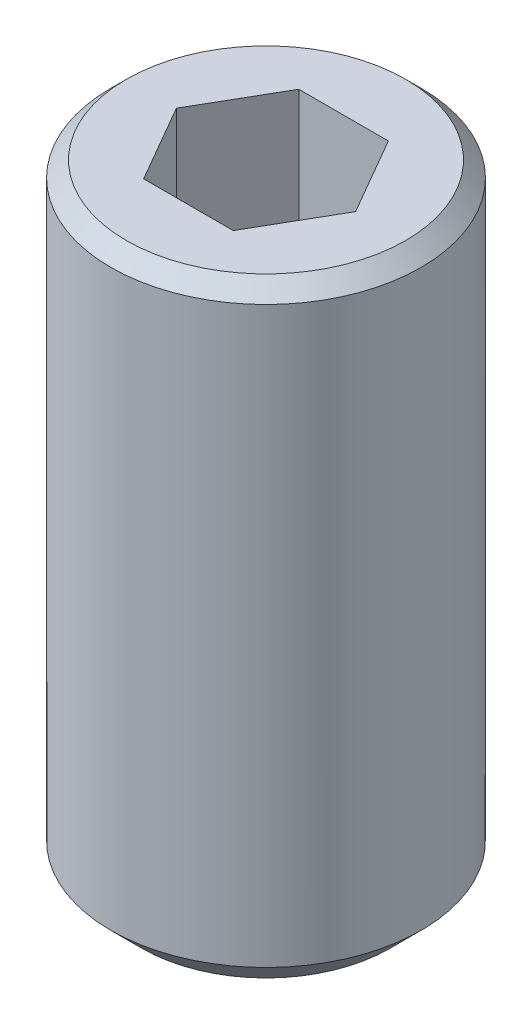
ISO-10303-21;
HEADER;
FILE_DESCRIPTION(('STEP AP214'),'2;1');
FILE_NAME('part.step','',(''),(''),'','','');
FILE_SCHEMA(('AUTOMOTIVE_DESIGN { 1 0 10303 214 1 1 1 1 }'));
ENDSEC;
DATA;
#1=APPLICATION_CONTEXT('core data for automotive mechanical design processes');
#2=APPLICATION_PROTOCOL_DEFINITION('international standard','automotive_design',2000,#1);
#3=PRODUCT_CONTEXT('',#1,'mechanical');
#4=PRODUCT('Part','Part','',(#3));
#5=PRODUCT_RELATED_PRODUCT_CATEGORY('part','',(#4));
#6=PRODUCT_DEFINITION_FORMATION('','',#4);
#7=PRODUCT_DEFINITION_CONTEXT('part definition',#1,'design');
#8=PRODUCT_DEFINITION('design','',#6,#7);
#9=PRODUCT_DEFINITION_SHAPE('','',#8);
#10=(LENGTH_UNIT() NAMED_UNIT(*) SI_UNIT(.MILLI.,.METRE.));
#11=(NAMED_UNIT(*) PLANE_ANGLE_UNIT() SI_UNIT($,.RADIAN.));
#12=(NAMED_UNIT(*) SI_UNIT($,.STERADIAN.) SOLID_ANGLE_UNIT());
#13=UNCERTAINTY_MEASURE_WITH_UNIT(LENGTH_MEASURE(1.E-05),#10,'distance_accuracy_value','');
#14=(GEOMETRIC_REPRESENTATION_CONTEXT(3) GLOBAL_UNCERTAINTY_ASSIGNED_CONTEXT((#13)) GLOBAL_UNIT_ASSIGNED_CONTEXT((#10,
#11,#12)) REPRESENTATION_CONTEXT('',''));
#15=CARTESIAN_POINT('',(0.,0.,0.));
#16=DIRECTION('',(0.,0.,1.));
#17=DIRECTION('',(1.,0.,0.));
#18=AXIS2_PLACEMENT_3D('',#15,#16,#17);
#19=CARTESIAN_POINT('',(0.,0.,0.));
#20=DIRECTION('',(0.,-1.,0.));
#21=DIRECTION('',(0.,0.,-1.));
#22=AXIS2_PLACEMENT_3D('',#19,#20,#21);
#23=PLANE('',#22);
#24=CARTESIAN_POINT('',(0.,0.,0.));
#25=DIRECTION('',(0.,-1.,0.));
#26=DIRECTION('',(0.,0.,-1.));
#27=AXIS2_PLACEMENT_3D('',#24,#25,#26);
#28=CIRCLE('',#27,1.35);
#29=CARTESIAN_POINT('',(0.,0.,-1.35));
#30=VERTEX_POINT('',#29);
#31=EDGE_CURVE('E42',#30,#30,#28,.F.);
#32=ORIENTED_EDGE('',*,*,#31,.T.);
#33=EDGE_LOOP('',(#32));
#34=FACE_BOUND('',#33,.T.);
#35=DIRECTION('',(-0.5,0.,0.866025403784439));
#36=VECTOR('',#35,1.);
#37=CARTESIAN_POINT('',(-0.43301270189222,0.,-0.75));
#38=LINE('',#37,#36);
#39=CARTESIAN_POINT('',(-0.43301270189222,0.,-0.75));
#40=VERTEX_POINT('',#39);
#41=CARTESIAN_POINT('',(-0.866025403784439,0.,0.));
#42=VERTEX_POINT('',#41);
#43=EDGE_CURVE('E123',#40,#42,#38,.T.);
#44=ORIENTED_EDGE('',*,*,#43,.F.);
#45=DIRECTION('',(-1.,0.,0.));
#46=VECTOR('',#45,1.);
#47=CARTESIAN_POINT('',(0.43301270189222,0.,-0.75));
#48=LINE('',#47,#46);
#49=CARTESIAN_POINT('',(0.43301270189222,0.,-0.75));
#50=VERTEX_POINT('',#49);
#51=EDGE_CURVE('E49',#50,#40,#48,.T.);
#52=ORIENTED_EDGE('',*,*,#51,.F.);
#53=DIRECTION('',(-0.5,0.,-0.866025403784439));
#54=VECTOR('',#53,1.);
#55=CARTESIAN_POINT('',(0.866025403784439,0.,0.));
#56=LINE('',#55,#54);
#57=CARTESIAN_POINT('',(0.866025403784439,0.,0.));
#58=VERTEX_POINT('',#57);
#59=EDGE_CURVE('E132',#58,#50,#56,.T.);
#60=ORIENTED_EDGE('',*,*,#59,.F.);
#61=DIRECTION('',(0.5,0.,-0.866025403784439));
#62=VECTOR('',#61,1.);
#63=CARTESIAN_POINT('',(0.43301270189222,0.,0.75));
#64=LINE('',#63,#62);
#65=CARTESIAN_POINT('',(0.43301270189222,0.,0.75));
#66=VERTEX_POINT('',#65);
#67=EDGE_CURVE('E130',#66,#58,#64,.T.);
#68=ORIENTED_EDGE('',*,*,#67,.F.);
#69=DIRECTION('',(1.,0.,0.));
#70=VECTOR('',#69,1.);
#71=CARTESIAN_POINT('',(-0.433012701892219,0.,0.750000000000001));
#72=LINE('',#71,#70);
#73=CARTESIAN_POINT('',(-0.433012701892219,0.,0.750000000000001));
#74=VERTEX_POINT('',#73);
#75=EDGE_CURVE('E97',#74,#66,#72,.T.);
#76=ORIENTED_EDGE('',*,*,#75,.F.);
#77=DIRECTION('',(0.5,0.,0.866025403784438));
#78=VECTOR('',#77,1.);
#79=CARTESIAN_POINT('',(-0.866025403784439,0.,0.));
#80=LINE('',#79,#78);
#81=EDGE_CURVE('E126',#42,#74,#80,.T.);
#82=ORIENTED_EDGE('',*,*,#81,.F.);
#83=EDGE_LOOP('',(#44,#52,#60,#68,#76,#82));
#84=FACE_BOUND('',#83,.T.);
#85=ADVANCED_FACE('F34',(#34,#84),#23,.F.);
#86=CARTESIAN_POINT('',(0.,0.,0.));
#87=DIRECTION('',(0.,1.,0.));
#88=DIRECTION('',(0.,0.,1.));
#89=AXIS2_PLACEMENT_3D('',#86,#87,#88);
#90=CYLINDRICAL_SURFACE('',#89,1.5);
#91=CARTESIAN_POINT('',(0.,-0.150000000000001,0.));
#92=DIRECTION('',(0.,-1.,0.));
#93=DIRECTION('',(0.,0.,-1.));
#94=AXIS2_PLACEMENT_3D('',#91,#92,#93);
#95=CIRCLE('',#94,1.5);
#96=CARTESIAN_POINT('',(0.,-0.150000000000001,-1.5));
#97=VERTEX_POINT('',#96);
#98=EDGE_CURVE('E11',#97,#97,#95,.T.);
#99=ORIENTED_EDGE('',*,*,#98,.T.);
#100=EDGE_LOOP('',(#99));
#101=FACE_BOUND('',#100,.T.);
#102=CARTESIAN_POINT('',(0.,-5.7,0.));
#103=DIRECTION('',(0.,1.,0.));
#104=DIRECTION('',(0.,0.,1.));
#105=AXIS2_PLACEMENT_3D('',#102,#103,#104);
#106=CIRCLE('',#105,1.5);
#107=CARTESIAN_POINT('',(0.,-5.7,1.5));
#108=VERTEX_POINT('',#107);
#109=EDGE_CURVE('E136',#108,#108,#106,.T.);
#110=ORIENTED_EDGE('',*,*,#109,.T.);
#111=EDGE_LOOP('',(#110));
#112=FACE_BOUND('',#111,.T.);
#113=ADVANCED_FACE('F160',(#101,#112),#90,.T.);
#114=CARTESIAN_POINT('',(1.5,-6.,0.));
#115=DIRECTION('',(0.,1.,0.));
#116=DIRECTION('',(0.,0.,1.));
#117=AXIS2_PLACEMENT_3D('',#114,#115,#116);
#118=PLANE('',#117);
#119=CARTESIAN_POINT('',(0.,-6.,0.));
#120=DIRECTION('',(0.,1.,0.));
#121=DIRECTION('',(0.,0.,1.));
#122=AXIS2_PLACEMENT_3D('',#119,#120,#121);
#123=CIRCLE('',#122,1.2);
#124=CARTESIAN_POINT('',(0.,-6.,1.2));
#125=VERTEX_POINT('',#124);
#126=EDGE_CURVE('E144',#125,#125,#123,.F.);
#127=ORIENTED_EDGE('',*,*,#126,.T.);
#128=EDGE_LOOP('',(#127));
#129=FACE_BOUND('',#128,.T.);
#130=ADVANCED_FACE('F165',(#129),#118,.F.);
#131=CARTESIAN_POINT('',(0.43301270189222,-1.5,-0.75));
#132=DIRECTION('',(0.,0.,-1.));
#133=DIRECTION('',(-1.,0.,0.));
#134=AXIS2_PLACEMENT_3D('',#131,#132,#133);
#135=PLANE('',#134);
#136=ORIENTED_EDGE('',*,*,#51,.T.);
#137=DIRECTION('',(0.,1.,0.));
#138=VECTOR('',#137,1.);
#139=CARTESIAN_POINT('',(-0.43301270189222,-1.5,-0.75));
#140=LINE('',#139,#138);
#141=CARTESIAN_POINT('',(-0.43301270189222,-1.5,-0.75));
#142=VERTEX_POINT('',#141);
#143=EDGE_CURVE('E79',#142,#40,#140,.T.);
#144=ORIENTED_EDGE('',*,*,#143,.F.);
#145=DIRECTION('',(-1.,0.,0.));
#146=VECTOR('',#145,1.);
#147=CARTESIAN_POINT('',(0.43301270189222,-1.5,-0.75));
#148=LINE('',#147,#146);
#149=CARTESIAN_POINT('',(0.43301270189222,-1.5,-0.75));
#150=VERTEX_POINT('',#149);
#151=EDGE_CURVE('E134',#150,#142,#148,.T.);
#152=ORIENTED_EDGE('',*,*,#151,.F.);
#153=DIRECTION('',(0.,1.,0.));
#154=VECTOR('',#153,1.);
#155=CARTESIAN_POINT('',(0.43301270189222,-1.5,-0.75));
#156=LINE('',#155,#154);
#157=EDGE_CURVE('E57',#150,#50,#156,.T.);
#158=ORIENTED_EDGE('',*,*,#157,.T.);
#159=EDGE_LOOP('',(#136,#144,#152,#158));
#160=FACE_BOUND('',#159,.T.);
#161=ADVANCED_FACE('F171',(#160),#135,.F.);
#162=CARTESIAN_POINT('',(0.866025403784439,-1.5,0.));
#163=DIRECTION('',(0.866025403784439,0.,-0.5));
#164=DIRECTION('',(-0.5,0.,-0.866025403784439));
#165=AXIS2_PLACEMENT_3D('',#162,#163,#164);
#166=PLANE('',#165);
#167=ORIENTED_EDGE('',*,*,#59,.T.);
#168=ORIENTED_EDGE('',*,*,#157,.F.);
#169=DIRECTION('',(-0.5,0.,-0.866025403784439));
#170=VECTOR('',#169,1.);
#171=CARTESIAN_POINT('',(0.866025403784439,-1.5,0.));
#172=LINE('',#171,#170);
#173=CARTESIAN_POINT('',(0.866025403784439,-1.5,0.));
#174=VERTEX_POINT('',#173);
#175=EDGE_CURVE('E109',#174,#150,#172,.T.);
#176=ORIENTED_EDGE('',*,*,#175,.F.);
#177=DIRECTION('',(0.,1.,0.));
#178=VECTOR('',#177,1.);
#179=CARTESIAN_POINT('',(0.866025403784439,-1.5,0.));
#180=LINE('',#179,#178);
#181=EDGE_CURVE('E101',#174,#58,#180,.T.);
#182=ORIENTED_EDGE('',*,*,#181,.T.);
#183=EDGE_LOOP('',(#167,#168,#176,#182));
#184=FACE_BOUND('',#183,.T.);
#185=ADVANCED_FACE('F175',(#184),#166,.F.);
#186=CARTESIAN_POINT('',(0.43301270189222,-1.5,0.75));
#187=DIRECTION('',(0.866025403784439,0.,0.5));
#188=DIRECTION('',(0.5,0.,-0.866025403784439));
#189=AXIS2_PLACEMENT_3D('',#186,#187,#188);
#190=PLANE('',#189);
#191=ORIENTED_EDGE('',*,*,#67,.T.);
#192=ORIENTED_EDGE('',*,*,#181,.F.);
#193=DIRECTION('',(0.5,0.,-0.866025403784439));
#194=VECTOR('',#193,1.);
#195=CARTESIAN_POINT('',(0.43301270189222,-1.5,0.75));
#196=LINE('',#195,#194);
#197=CARTESIAN_POINT('',(0.43301270189222,-1.5,0.75));
#198=VERTEX_POINT('',#197);
#199=EDGE_CURVE('E105',#198,#174,#196,.T.);
#200=ORIENTED_EDGE('',*,*,#199,.F.);
#201=DIRECTION('',(0.,1.,0.));
#202=VECTOR('',#201,1.);
#203=CARTESIAN_POINT('',(0.43301270189222,-1.5,0.75));
#204=LINE('',#203,#202);
#205=EDGE_CURVE('E90',#198,#66,#204,.T.);
#206=ORIENTED_EDGE('',*,*,#205,.T.);
#207=EDGE_LOOP('',(#191,#192,#200,#206));
#208=FACE_BOUND('',#207,.T.);
#209=ADVANCED_FACE('F106',(#208),#190,.F.);
#210=CARTESIAN_POINT('',(-0.433012701892219,-1.5,0.750000000000001));
#211=DIRECTION('',(0.,0.,1.));
#212=DIRECTION('',(1.,0.,0.));
#213=AXIS2_PLACEMENT_3D('',#210,#211,#212);
#214=PLANE('',#213);
#215=ORIENTED_EDGE('',*,*,#75,.T.);
#216=ORIENTED_EDGE('',*,*,#205,.F.);
#217=DIRECTION('',(1.,0.,0.));
#218=VECTOR('',#217,1.);
#219=CARTESIAN_POINT('',(-0.433012701892219,-1.5,0.750000000000001));
#220=LINE('',#219,#218);
#221=CARTESIAN_POINT('',(-0.433012701892219,-1.5,0.750000000000001));
#222=VERTEX_POINT('',#221);
#223=EDGE_CURVE('E94',#222,#198,#220,.T.);
#224=ORIENTED_EDGE('',*,*,#223,.F.);
#225=DIRECTION('',(0.,1.,0.));
#226=VECTOR('',#225,1.);
#227=CARTESIAN_POINT('',(-0.433012701892219,-1.5,0.750000000000001));
#228=LINE('',#227,#226);
#229=EDGE_CURVE('E102',#222,#74,#228,.T.);
#230=ORIENTED_EDGE('',*,*,#229,.T.);
#231=EDGE_LOOP('',(#215,#216,#224,#230));
#232=FACE_BOUND('',#231,.T.);
#233=ADVANCED_FACE('F92',(#232),#214,.F.);
#234=CARTESIAN_POINT('',(-0.866025403784439,-1.5,0.));
#235=DIRECTION('',(-0.866025403784438,0.,0.5));
#236=DIRECTION('',(0.5,0.,0.866025403784438));
#237=AXIS2_PLACEMENT_3D('',#234,#235,#236);
#238=PLANE('',#237);
#239=ORIENTED_EDGE('',*,*,#81,.T.);
#240=ORIENTED_EDGE('',*,*,#229,.F.);
#241=DIRECTION('',(0.5,0.,0.866025403784438));
#242=VECTOR('',#241,1.);
#243=CARTESIAN_POINT('',(-0.866025403784439,-1.5,0.));
#244=LINE('',#243,#242);
#245=CARTESIAN_POINT('',(-0.866025403784439,-1.5,0.));
#246=VERTEX_POINT('',#245);
#247=EDGE_CURVE('E115',#246,#222,#244,.T.);
#248=ORIENTED_EDGE('',*,*,#247,.F.);
#249=DIRECTION('',(0.,1.,0.));
#250=VECTOR('',#249,1.);
#251=CARTESIAN_POINT('',(-0.866025403784439,-1.5,0.));
#252=LINE('',#251,#250);
#253=EDGE_CURVE('E139',#246,#42,#252,.T.);
#254=ORIENTED_EDGE('',*,*,#253,.T.);
#255=EDGE_LOOP('',(#239,#240,#248,#254));
#256=FACE_BOUND('',#255,.T.);
#257=ADVANCED_FACE('F179',(#256),#238,.F.);
#258=CARTESIAN_POINT('',(-0.43301270189222,-1.5,-0.75));
#259=DIRECTION('',(-0.866025403784439,0.,-0.5));
#260=DIRECTION('',(-0.5,0.,0.866025403784439));
#261=AXIS2_PLACEMENT_3D('',#258,#259,#260);
#262=PLANE('',#261);
#263=ORIENTED_EDGE('',*,*,#43,.T.);
#264=ORIENTED_EDGE('',*,*,#253,.F.);
#265=DIRECTION('',(-0.5,0.,0.866025403784439));
#266=VECTOR('',#265,1.);
#267=CARTESIAN_POINT('',(-0.43301270189222,-1.5,-0.75));
#268=LINE('',#267,#266);
#269=EDGE_CURVE('E117',#142,#246,#268,.T.);
#270=ORIENTED_EDGE('',*,*,#269,.F.);
#271=ORIENTED_EDGE('',*,*,#143,.T.);
#272=EDGE_LOOP('',(#263,#264,#270,#271));
#273=FACE_BOUND('',#272,.T.);
#274=ADVANCED_FACE('F176',(#273),#262,.F.);
#275=CARTESIAN_POINT('',(-0.43301270189222,-1.5,-0.75));
#276=DIRECTION('',(0.,1.,0.));
#277=DIRECTION('',(0.,0.,1.));
#278=AXIS2_PLACEMENT_3D('',#275,#276,#277);
#279=PLANE('',#278);
#280=ORIENTED_EDGE('',*,*,#151,.T.);
#281=ORIENTED_EDGE('',*,*,#269,.T.);
#282=ORIENTED_EDGE('',*,*,#247,.T.);
#283=ORIENTED_EDGE('',*,*,#223,.T.);
#284=ORIENTED_EDGE('',*,*,#199,.T.);
#285=ORIENTED_EDGE('',*,*,#175,.T.);
#286=EDGE_LOOP('',(#280,#281,#282,#283,#284,#285));
#287=FACE_BOUND('',#286,.T.);
#288=ADVANCED_FACE('F112',(#287),#279,.T.);
#289=CARTESIAN_POINT('',(0.,-5.7,0.));
#290=DIRECTION('',(0.,1.,0.));
#291=DIRECTION('',(0.,0.,1.));
#292=AXIS2_PLACEMENT_3D('',#289,#290,#291);
#293=CONICAL_SURFACE('',#292,1.5,0.785398163397451);
#294=ORIENTED_EDGE('',*,*,#126,.F.);
#295=EDGE_LOOP('',(#294));
#296=FACE_BOUND('',#295,.T.);
#297=ORIENTED_EDGE('',*,*,#109,.F.);
#298=EDGE_LOOP('',(#297));
#299=FACE_BOUND('',#298,.T.);
#300=ADVANCED_FACE('F152',(#296,#299),#293,.T.);
#301=CARTESIAN_POINT('',(0.,0.,0.));
#302=DIRECTION('',(0.,-1.,0.));
#303=DIRECTION('',(0.,0.,-1.));
#304=AXIS2_PLACEMENT_3D('',#301,#302,#303);
#305=CONICAL_SURFACE('',#304,1.35,0.785398163397446);
#306=CARTESIAN_POINT('',(0.,-0.150000000000001,-1.5));
#307=CARTESIAN_POINT('',(0.,-0.148437500000001,-1.4984375));
#308=CARTESIAN_POINT('',(0.,-0.146875000000001,-1.496875));
#309=CARTESIAN_POINT('',(0.,-0.143750000000001,-1.49375));
#310=CARTESIAN_POINT('',(0.,-0.142187500000001,-1.4921875));
#311=CARTESIAN_POINT('',(0.,-0.139062500000001,-1.4890625));
#312=CARTESIAN_POINT('',(0.,-0.137500000000001,-1.4875));
#313=CARTESIAN_POINT('',(0.,-0.134375000000001,-1.484375));
#314=CARTESIAN_POINT('',(0.,-0.132812500000001,-1.4828125));
#315=CARTESIAN_POINT('',(0.,-0.129687500000001,-1.4796875));
#316=CARTESIAN_POINT('',(0.,-0.128125000000001,-1.478125));
#317=CARTESIAN_POINT('',(0.,-0.125000000000001,-1.475));
#318=CARTESIAN_POINT('',(0.,-0.123437500000001,-1.4734375));
#319=CARTESIAN_POINT('',(0.,-0.120312500000001,-1.4703125));
#320=CARTESIAN_POINT('',(0.,-0.118750000000001,-1.46875));
#321=CARTESIAN_POINT('',(0.,-0.115625000000001,-1.465625));
#322=CARTESIAN_POINT('',(0.,-0.114062500000001,-1.4640625));
#323=CARTESIAN_POINT('',(0.,-0.110937500000001,-1.4609375));
#324=CARTESIAN_POINT('',(0.,-0.109375000000001,-1.459375));
#325=CARTESIAN_POINT('',(0.,-0.106250000000001,-1.45625));
#326=CARTESIAN_POINT('',(0.,-0.104687500000001,-1.4546875));
#327=CARTESIAN_POINT('',(0.,-0.101562500000001,-1.4515625));
#328=CARTESIAN_POINT('',(0.,-0.100000000000001,-1.45));
#329=CARTESIAN_POINT('',(0.,-0.096875000000001,-1.446875));
#330=CARTESIAN_POINT('',(0.,-0.095312500000001,-1.4453125));
#331=CARTESIAN_POINT('',(0.,-0.0921875000000009,-1.4421875));
#332=CARTESIAN_POINT('',(0.,-0.0906250000000009,-1.440625));
#333=CARTESIAN_POINT('',(0.,-0.0875000000000009,-1.4375));
#334=CARTESIAN_POINT('',(0.,-0.0859375000000009,-1.4359375));
#335=CARTESIAN_POINT('',(0.,-0.0828125000000009,-1.4328125));
#336=CARTESIAN_POINT('',(0.,-0.0812500000000008,-1.43125));
#337=CARTESIAN_POINT('',(0.,-0.0781250000000008,-1.428125));
#338=CARTESIAN_POINT('',(0.,-0.0765625000000008,-1.4265625));
#339=CARTESIAN_POINT('',(0.,-0.0734375000000008,-1.4234375));
#340=CARTESIAN_POINT('',(0.,-0.0718750000000007,-1.421875));
#341=CARTESIAN_POINT('',(0.,-0.0687500000000007,-1.41875));
#342=CARTESIAN_POINT('',(0.,-0.0671875000000007,-1.4171875));
#343=CARTESIAN_POINT('',(0.,-0.0640625000000007,-1.4140625));
#344=CARTESIAN_POINT('',(0.,-0.0625000000000006,-1.4125));
#345=CARTESIAN_POINT('',(0.,-0.0593750000000006,-1.409375));
#346=CARTESIAN_POINT('',(0.,-0.0578125000000006,-1.4078125));
#347=CARTESIAN_POINT('',(0.,-0.0546875000000006,-1.4046875));
#348=CARTESIAN_POINT('',(0.,-0.0531250000000005,-1.403125));
#349=CARTESIAN_POINT('',(0.,-0.0500000000000005,-1.4));
#350=CARTESIAN_POINT('',(0.,-0.0484375000000005,-1.3984375));
#351=CARTESIAN_POINT('',(0.,-0.0453125000000005,-1.3953125));
#352=CARTESIAN_POINT('',(0.,-0.0437500000000004,-1.39375));
#353=CARTESIAN_POINT('',(0.,-0.0406250000000004,-1.390625));
#354=CARTESIAN_POINT('',(0.,-0.0390625000000004,-1.3890625));
#355=CARTESIAN_POINT('',(0.,-0.0359375000000004,-1.3859375));
#356=CARTESIAN_POINT('',(0.,-0.0343750000000003,-1.384375));
#357=CARTESIAN_POINT('',(0.,-0.0312500000000003,-1.38125));
#358=CARTESIAN_POINT('',(0.,-0.0296875000000003,-1.3796875));
#359=CARTESIAN_POINT('',(0.,-0.0265625000000003,-1.3765625));
#360=CARTESIAN_POINT('',(0.,-0.0250000000000002,-1.375));
#361=CARTESIAN_POINT('',(0.,-0.0218750000000002,-1.371875));
#362=CARTESIAN_POINT('',(0.,-0.0203125000000002,-1.3703125));
#363=CARTESIAN_POINT('',(0.,-0.0171875000000002,-1.3671875));
#364=CARTESIAN_POINT('',(0.,-0.0156250000000002,-1.365625));
#365=CARTESIAN_POINT('',(0.,-0.0125000000000001,-1.3625));
#366=CARTESIAN_POINT('',(0.,-0.0109375000000001,-1.3609375));
#367=CARTESIAN_POINT('',(0.,-0.00781250000000008,-1.3578125));
#368=CARTESIAN_POINT('',(0.,-0.00625000000000006,-1.35625));
#369=CARTESIAN_POINT('',(0.,-0.00312500000000001,-1.353125));
#370=CARTESIAN_POINT('',(0.,-0.00156249999999999,-1.3515625));
#371=CARTESIAN_POINT('',(0.,0.,-1.35));
#372=B_SPLINE_CURVE_WITH_KNOTS('',3,(#306,#307,#308,#309,#310,#311,#312,#313,#314,#315,#316,
#317,#318,#319,#320,#321,#322,#323,#324,#325,#326,#327,#328,#329,#330,#331,#332,#333,#334,#335,
#336,#337,#338,#339,#340,#341,#342,#343,#344,#345,#346,#347,#348,#349,#350,#351,#352,#353,#354,
#355,#356,#357,#358,#359,#360,#361,#362,#363,#364,#365,#366,#367,#368,#369,#370,#371),
.UNSPECIFIED.,.F.,.F.,(4,2,2,2,2,2,2,2,2,2,2,2,2,2,2,2,2,2,2,2,2,2,2,2,2,2,2,2,2,2,2,2,4),(0.,
0.00662912607362386,0.0132582521472479,0.0198873782208717,0.0265165042944957,0.0331456303681196,
0.0397747564417436,0.0464038825153675,0.0530330085889915,0.0596621346626153,0.0662912607362394,
0.0729203868098632,0.0795495128834872,0.0861786389571111,0.0928077650307351,0.099436891104359,
0.106066017177983,0.112695143251607,0.119324269325231,0.125953395398855,0.132582521472479,
0.139211647546103,0.145840773619727,0.15246989969335,0.159099025766974,0.165728151840598,
0.172357277914222,0.178986403987846,0.18561553006147,0.192244656135094,0.198873782208718,
0.205502908282342,0.212132034355966),.UNSPECIFIED.);
#373=EDGE_CURVE('BSEAM36',#97,#30,#372,.T.);
#374=ORIENTED_EDGE('',*,*,#98,.F.);
#375=ORIENTED_EDGE('',*,*,#31,.F.);
#376=ORIENTED_EDGE('',*,*,#373,.T.);
#377=ORIENTED_EDGE('',*,*,#373,.F.);
#378=EDGE_LOOP('',(#374,#376,#375,#377));
#379=FACE_BOUND('',#378,.T.);
#380=ADVANCED_FACE('F36',(#379),#305,.T.);
#381=CLOSED_SHELL('',(#85,#113,#130,#161,#185,#209,#233,#257,#274,#288,#300,#380));
#382=MANIFOLD_SOLID_BREP('B2',#381);
#383=ADVANCED_BREP_SHAPE_REPRESENTATION('',(#18,#382),#14);
#384=SHAPE_DEFINITION_REPRESENTATION(#9,#383);
ENDSEC;
END-ISO-10303-21;
